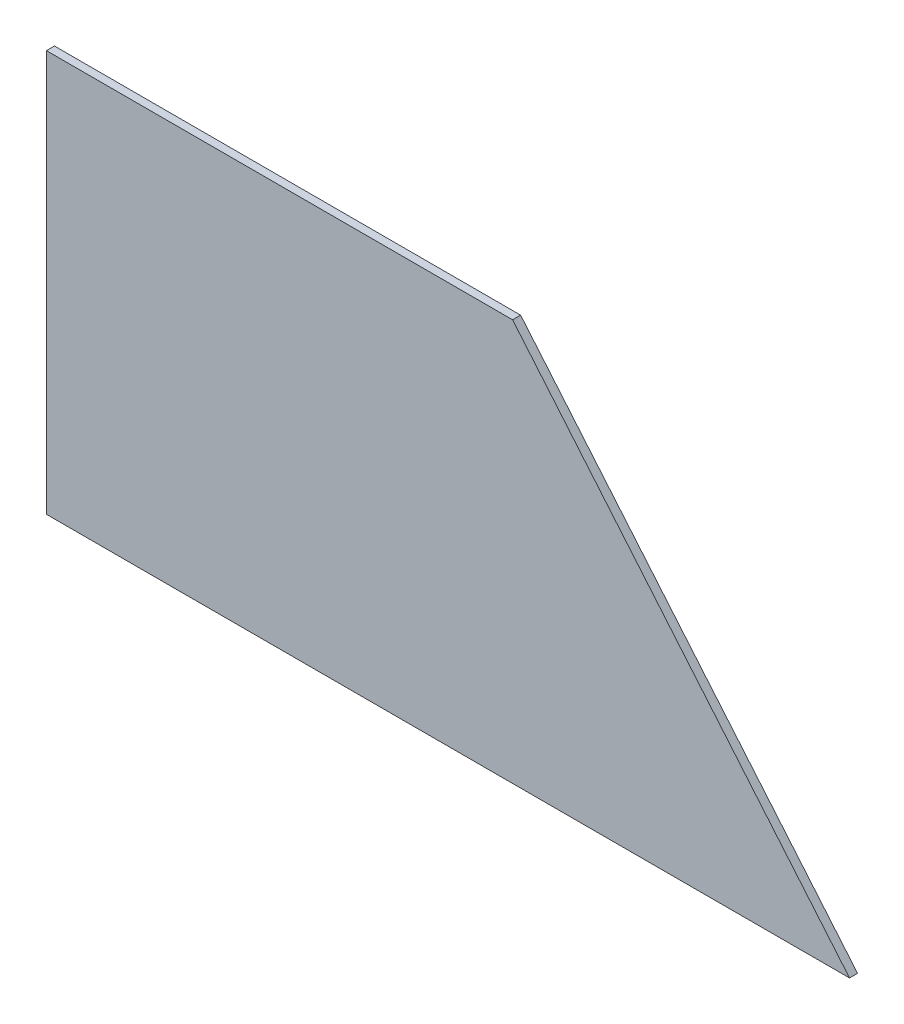
ISO-10303-21;
HEADER;
FILE_DESCRIPTION(('STEP AP214'),'2;1');
FILE_NAME('part.step','',(''),(''),'','','');
FILE_SCHEMA(('AUTOMOTIVE_DESIGN { 1 0 10303 214 1 1 1 1 }'));
ENDSEC;
DATA;
#1=APPLICATION_CONTEXT('core data for automotive mechanical design processes');
#2=APPLICATION_PROTOCOL_DEFINITION('international standard','automotive_design',2000,#1);
#3=PRODUCT_CONTEXT('',#1,'mechanical');
#4=PRODUCT('Part','Part','',(#3));
#5=PRODUCT_RELATED_PRODUCT_CATEGORY('part','',(#4));
#6=PRODUCT_DEFINITION_FORMATION('','',#4);
#7=PRODUCT_DEFINITION_CONTEXT('part definition',#1,'design');
#8=PRODUCT_DEFINITION('design','',#6,#7);
#9=PRODUCT_DEFINITION_SHAPE('','',#8);
#10=(LENGTH_UNIT() NAMED_UNIT(*) SI_UNIT(.MILLI.,.METRE.));
#11=(NAMED_UNIT(*) PLANE_ANGLE_UNIT() SI_UNIT($,.RADIAN.));
#12=(NAMED_UNIT(*) SI_UNIT($,.STERADIAN.) SOLID_ANGLE_UNIT());
#13=UNCERTAINTY_MEASURE_WITH_UNIT(LENGTH_MEASURE(1.E-05),#10,'distance_accuracy_value','');
#14=(GEOMETRIC_REPRESENTATION_CONTEXT(3) GLOBAL_UNCERTAINTY_ASSIGNED_CONTEXT((#13)) GLOBAL_UNIT_ASSIGNED_CONTEXT((#10,
#11,#12)) REPRESENTATION_CONTEXT('',''));
#15=CARTESIAN_POINT('',(0.,0.,0.));
#16=DIRECTION('',(0.,0.,1.));
#17=DIRECTION('',(1.,0.,0.));
#18=AXIS2_PLACEMENT_3D('',#15,#16,#17);
#19=CARTESIAN_POINT('',(200.,0.,2.));
#20=DIRECTION('',(-0.766044443118974,-0.642787609686544,0.));
#21=DIRECTION('',(0.642787609686544,-0.766044443118974,0.));
#22=AXIS2_PLACEMENT_3D('',#19,#20,#21);
#23=PLANE('',#22);
#24=DIRECTION('',(-0.642787609686544,0.766044443118974,0.));
#25=VECTOR('',#24,1.);
#26=CARTESIAN_POINT('',(200.,0.,0.));
#27=LINE('',#26,#25);
#28=CARTESIAN_POINT('',(200.,0.,0.));
#29=VERTEX_POINT('',#28);
#30=CARTESIAN_POINT('',(116.090036882271,100.,0.));
#31=VERTEX_POINT('',#30);
#32=EDGE_CURVE('E98',#29,#31,#27,.T.);
#33=ORIENTED_EDGE('',*,*,#32,.T.);
#34=DIRECTION('',(0.,0.,-1.));
#35=VECTOR('',#34,1.);
#36=CARTESIAN_POINT('',(116.090036882271,100.,2.));
#37=LINE('',#36,#35);
#38=CARTESIAN_POINT('',(116.090036882271,100.,2.));
#39=VERTEX_POINT('',#38);
#40=EDGE_CURVE('E11',#39,#31,#37,.T.);
#41=ORIENTED_EDGE('',*,*,#40,.F.);
#42=DIRECTION('',(-0.642787609686544,0.766044443118974,0.));
#43=VECTOR('',#42,1.);
#44=CARTESIAN_POINT('',(200.,0.,2.));
#45=LINE('',#44,#43);
#46=CARTESIAN_POINT('',(200.,0.,2.));
#47=VERTEX_POINT('',#46);
#48=EDGE_CURVE('E86',#47,#39,#45,.T.);
#49=ORIENTED_EDGE('',*,*,#48,.F.);
#50=DIRECTION('',(0.,0.,-1.));
#51=VECTOR('',#50,1.);
#52=CARTESIAN_POINT('',(200.,0.,2.));
#53=LINE('',#52,#51);
#54=EDGE_CURVE('E94',#47,#29,#53,.T.);
#55=ORIENTED_EDGE('',*,*,#54,.T.);
#56=EDGE_LOOP('',(#33,#41,#49,#55));
#57=FACE_BOUND('',#56,.T.);
#58=ADVANCED_FACE('F35',(#57),#23,.F.);
#59=CARTESIAN_POINT('',(116.090036882271,100.,2.));
#60=DIRECTION('',(0.,-1.,0.));
#61=DIRECTION('',(0.,0.,-1.));
#62=AXIS2_PLACEMENT_3D('',#59,#60,#61);
#63=PLANE('',#62);
#64=DIRECTION('',(-1.,0.,0.));
#65=VECTOR('',#64,1.);
#66=CARTESIAN_POINT('',(116.090036882271,100.,0.));
#67=LINE('',#66,#65);
#68=CARTESIAN_POINT('',(0.,100.,0.));
#69=VERTEX_POINT('',#68);
#70=EDGE_CURVE('E90',#31,#69,#67,.T.);
#71=ORIENTED_EDGE('',*,*,#70,.T.);
#72=DIRECTION('',(0.,0.,-1.));
#73=VECTOR('',#72,1.);
#74=CARTESIAN_POINT('',(0.,100.,2.));
#75=LINE('',#74,#73);
#76=CARTESIAN_POINT('',(0.,100.,2.));
#77=VERTEX_POINT('',#76);
#78=EDGE_CURVE('E43',#77,#69,#75,.T.);
#79=ORIENTED_EDGE('',*,*,#78,.F.);
#80=DIRECTION('',(-1.,0.,0.));
#81=VECTOR('',#80,1.);
#82=CARTESIAN_POINT('',(116.090036882271,100.,2.));
#83=LINE('',#82,#81);
#84=EDGE_CURVE('E81',#39,#77,#83,.T.);
#85=ORIENTED_EDGE('',*,*,#84,.F.);
#86=ORIENTED_EDGE('',*,*,#40,.T.);
#87=EDGE_LOOP('',(#71,#79,#85,#86));
#88=FACE_BOUND('',#87,.T.);
#89=ADVANCED_FACE('F89',(#88),#63,.F.);
#90=CARTESIAN_POINT('',(0.,100.,2.));
#91=DIRECTION('',(1.,0.,0.));
#92=DIRECTION('',(0.,1.,0.));
#93=AXIS2_PLACEMENT_3D('',#90,#91,#92);
#94=PLANE('',#93);
#95=DIRECTION('',(0.,-1.,0.));
#96=VECTOR('',#95,1.);
#97=CARTESIAN_POINT('',(0.,100.,0.));
#98=LINE('',#97,#96);
#99=CARTESIAN_POINT('',(0.,0.,0.));
#100=VERTEX_POINT('',#99);
#101=EDGE_CURVE('E68',#69,#100,#98,.T.);
#102=ORIENTED_EDGE('',*,*,#101,.T.);
#103=DIRECTION('',(0.,0.,-1.));
#104=VECTOR('',#103,1.);
#105=CARTESIAN_POINT('',(0.,0.,2.));
#106=LINE('',#105,#104);
#107=CARTESIAN_POINT('',(0.,0.,2.));
#108=VERTEX_POINT('',#107);
#109=EDGE_CURVE('E91',#108,#100,#106,.T.);
#110=ORIENTED_EDGE('',*,*,#109,.F.);
#111=DIRECTION('',(0.,-1.,0.));
#112=VECTOR('',#111,1.);
#113=CARTESIAN_POINT('',(0.,100.,2.));
#114=LINE('',#113,#112);
#115=EDGE_CURVE('E84',#77,#108,#114,.T.);
#116=ORIENTED_EDGE('',*,*,#115,.F.);
#117=ORIENTED_EDGE('',*,*,#78,.T.);
#118=EDGE_LOOP('',(#102,#110,#116,#117));
#119=FACE_BOUND('',#118,.T.);
#120=ADVANCED_FACE('F92',(#119),#94,.F.);
#121=CARTESIAN_POINT('',(0.,0.,2.));
#122=DIRECTION('',(0.,1.,0.));
#123=DIRECTION('',(0.,0.,1.));
#124=AXIS2_PLACEMENT_3D('',#121,#122,#123);
#125=PLANE('',#124);
#126=DIRECTION('',(1.,0.,0.));
#127=VECTOR('',#126,1.);
#128=CARTESIAN_POINT('',(0.,0.,0.));
#129=LINE('',#128,#127);
#130=EDGE_CURVE('E74',#100,#29,#129,.T.);
#131=ORIENTED_EDGE('',*,*,#130,.T.);
#132=ORIENTED_EDGE('',*,*,#54,.F.);
#133=DIRECTION('',(1.,0.,0.));
#134=VECTOR('',#133,1.);
#135=CARTESIAN_POINT('',(0.,0.,2.));
#136=LINE('',#135,#134);
#137=EDGE_CURVE('E51',#108,#47,#136,.T.);
#138=ORIENTED_EDGE('',*,*,#137,.F.);
#139=ORIENTED_EDGE('',*,*,#109,.T.);
#140=EDGE_LOOP('',(#131,#132,#138,#139));
#141=FACE_BOUND('',#140,.T.);
#142=ADVANCED_FACE('F105',(#141),#125,.F.);
#143=CARTESIAN_POINT('',(0.,0.,2.));
#144=DIRECTION('',(0.,0.,1.));
#145=DIRECTION('',(1.,0.,0.));
#146=AXIS2_PLACEMENT_3D('',#143,#144,#145);
#147=PLANE('',#146);
#148=ORIENTED_EDGE('',*,*,#48,.T.);
#149=ORIENTED_EDGE('',*,*,#84,.T.);
#150=ORIENTED_EDGE('',*,*,#115,.T.);
#151=ORIENTED_EDGE('',*,*,#137,.T.);
#152=EDGE_LOOP('',(#148,#149,#150,#151));
#153=FACE_BOUND('',#152,.T.);
#154=ADVANCED_FACE('F82',(#153),#147,.T.);
#155=CARTESIAN_POINT('',(0.,0.,0.));
#156=DIRECTION('',(0.,0.,1.));
#157=DIRECTION('',(1.,0.,0.));
#158=AXIS2_PLACEMENT_3D('',#155,#156,#157);
#159=PLANE('',#158);
#160=ORIENTED_EDGE('',*,*,#32,.F.);
#161=ORIENTED_EDGE('',*,*,#130,.F.);
#162=ORIENTED_EDGE('',*,*,#101,.F.);
#163=ORIENTED_EDGE('',*,*,#70,.F.);
#164=EDGE_LOOP('',(#160,#161,#162,#163));
#165=FACE_BOUND('',#164,.T.);
#166=ADVANCED_FACE('F108',(#165),#159,.F.);
#167=CLOSED_SHELL('',(#58,#89,#120,#142,#154,#166));
#168=MANIFOLD_SOLID_BREP('B2',#167);
#169=ADVANCED_BREP_SHAPE_REPRESENTATION('',(#18,#168),#14);
#170=SHAPE_DEFINITION_REPRESENTATION(#9,#169);
ENDSEC;
END-ISO-10303-21;
